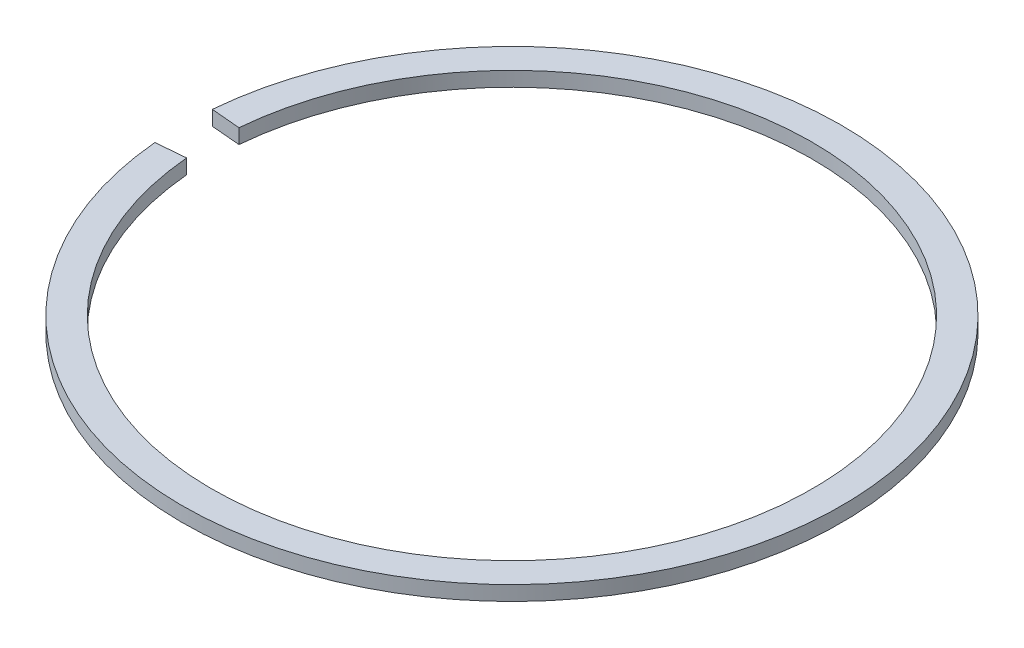
ISO-10303-21;
HEADER;
FILE_DESCRIPTION(('STEP AP214'),'2;1');
FILE_NAME('part.step','',(''),(''),'','','');
FILE_SCHEMA(('AUTOMOTIVE_DESIGN { 1 0 10303 214 1 1 1 1 }'));
ENDSEC;
DATA;
#1=APPLICATION_CONTEXT('core data for automotive mechanical design processes');
#2=APPLICATION_PROTOCOL_DEFINITION('international standard','automotive_design',2000,#1);
#3=PRODUCT_CONTEXT('',#1,'mechanical');
#4=PRODUCT('Part','Part','',(#3));
#5=PRODUCT_RELATED_PRODUCT_CATEGORY('part','',(#4));
#6=PRODUCT_DEFINITION_FORMATION('','',#4);
#7=PRODUCT_DEFINITION_CONTEXT('part definition',#1,'design');
#8=PRODUCT_DEFINITION('design','',#6,#7);
#9=PRODUCT_DEFINITION_SHAPE('','',#8);
#10=(LENGTH_UNIT() NAMED_UNIT(*) SI_UNIT(.MILLI.,.METRE.));
#11=(NAMED_UNIT(*) PLANE_ANGLE_UNIT() SI_UNIT($,.RADIAN.));
#12=(NAMED_UNIT(*) SI_UNIT($,.STERADIAN.) SOLID_ANGLE_UNIT());
#13=UNCERTAINTY_MEASURE_WITH_UNIT(LENGTH_MEASURE(1.E-05),#10,'distance_accuracy_value','');
#14=(GEOMETRIC_REPRESENTATION_CONTEXT(3) GLOBAL_UNCERTAINTY_ASSIGNED_CONTEXT((#13)) GLOBAL_UNIT_ASSIGNED_CONTEXT((#10,
#11,#12)) REPRESENTATION_CONTEXT('',''));
#15=CARTESIAN_POINT('',(0.,0.,0.));
#16=DIRECTION('',(0.,0.,1.));
#17=DIRECTION('',(1.,0.,0.));
#18=AXIS2_PLACEMENT_3D('',#15,#16,#17);
#19=CARTESIAN_POINT('',(0.,0.,0.));
#20=DIRECTION('',(0.,-1.,0.));
#21=DIRECTION('',(0.,0.,-1.));
#22=AXIS2_PLACEMENT_3D('',#19,#20,#21);
#23=CYLINDRICAL_SURFACE('',#22,41.);
#24=CARTESIAN_POINT('',(0.,0.,0.));
#25=DIRECTION('',(0.,-1.,0.));
#26=DIRECTION('',(0.,0.,-1.));
#27=AXIS2_PLACEMENT_3D('',#24,#25,#26);
#28=CIRCLE('',#27,41.);
#29=CARTESIAN_POINT('',(-40.8439826217616,0.,-3.57338545265371));
#30=VERTEX_POINT('',#29);
#31=CARTESIAN_POINT('',(-40.8439826217616,0.,3.57338545265371));
#32=VERTEX_POINT('',#31);
#33=EDGE_CURVE('E11',#30,#32,#28,.T.);
#34=ORIENTED_EDGE('',*,*,#33,.T.);
#35=DIRECTION('',(0.,-1.,0.));
#36=VECTOR('',#35,1.);
#37=CARTESIAN_POINT('',(-40.8439826217616,2.,3.57338545265371));
#38=LINE('',#37,#36);
#39=CARTESIAN_POINT('',(-40.8439826217616,2.,3.57338545265371));
#40=VERTEX_POINT('',#39);
#41=EDGE_CURVE('E76',#40,#32,#38,.T.);
#42=ORIENTED_EDGE('',*,*,#41,.F.);
#43=CARTESIAN_POINT('',(0.,2.,0.));
#44=DIRECTION('',(0.,-1.,0.));
#45=DIRECTION('',(0.,0.,-1.));
#46=AXIS2_PLACEMENT_3D('',#43,#44,#45);
#47=CIRCLE('',#46,41.);
#48=CARTESIAN_POINT('',(-40.8439826217616,2.,-3.57338545265371));
#49=VERTEX_POINT('',#48);
#50=EDGE_CURVE('E51',#49,#40,#47,.T.);
#51=ORIENTED_EDGE('',*,*,#50,.F.);
#52=DIRECTION('',(0.,-1.,0.));
#53=VECTOR('',#52,1.);
#54=CARTESIAN_POINT('',(-40.8439826217616,2.,-3.57338545265371));
#55=LINE('',#54,#53);
#56=EDGE_CURVE('E78',#49,#30,#55,.T.);
#57=ORIENTED_EDGE('',*,*,#56,.T.);
#58=EDGE_LOOP('',(#34,#42,#51,#57));
#59=FACE_BOUND('',#58,.T.);
#60=ADVANCED_FACE('F36',(#59),#23,.F.);
#61=CARTESIAN_POINT('',(-40.8439826217616,0.,-3.57338545265371));
#62=DIRECTION('',(0.,-1.,0.));
#63=DIRECTION('',(0.,0.,-1.));
#64=AXIS2_PLACEMENT_3D('',#61,#62,#63);
#65=PLANE('',#64);
#66=CARTESIAN_POINT('',(0.,0.,0.));
#67=DIRECTION('',(0.,-1.,0.));
#68=DIRECTION('',(0.,0.,-1.));
#69=AXIS2_PLACEMENT_3D('',#66,#67,#68);
#70=CIRCLE('',#69,45.);
#71=CARTESIAN_POINT('',(-44.8287614141286,0.,-3.92200842364432));
#72=VERTEX_POINT('',#71);
#73=CARTESIAN_POINT('',(-44.8287614141286,0.,3.92200842364432));
#74=VERTEX_POINT('',#73);
#75=EDGE_CURVE('E44',#72,#74,#70,.T.);
#76=ORIENTED_EDGE('',*,*,#75,.T.);
#77=DIRECTION('',(-0.996194698091746,0.,0.0871557427476516));
#78=VECTOR('',#77,1.);
#79=CARTESIAN_POINT('',(-40.8439826217616,0.,3.57338545265371));
#80=LINE('',#79,#78);
#81=EDGE_CURVE('E87',#32,#74,#80,.T.);
#82=ORIENTED_EDGE('',*,*,#81,.F.);
#83=ORIENTED_EDGE('',*,*,#33,.F.);
#84=DIRECTION('',(-0.996194698091746,0.,-0.0871557427476515));
#85=VECTOR('',#84,1.);
#86=CARTESIAN_POINT('',(-40.8439826217616,0.,-3.57338545265371));
#87=LINE('',#86,#85);
#88=EDGE_CURVE('E97',#30,#72,#87,.T.);
#89=ORIENTED_EDGE('',*,*,#88,.T.);
#90=EDGE_LOOP('',(#76,#82,#83,#89));
#91=FACE_BOUND('',#90,.T.);
#92=ADVANCED_FACE('F38',(#91),#65,.T.);
#93=CARTESIAN_POINT('',(0.,0.,0.));
#94=DIRECTION('',(0.,-1.,0.));
#95=DIRECTION('',(0.,0.,-1.));
#96=AXIS2_PLACEMENT_3D('',#93,#94,#95);
#97=CYLINDRICAL_SURFACE('',#96,45.);
#98=CARTESIAN_POINT('',(0.,2.,0.));
#99=DIRECTION('',(0.,-1.,0.));
#100=DIRECTION('',(0.,0.,-1.));
#101=AXIS2_PLACEMENT_3D('',#98,#99,#100);
#102=CIRCLE('',#101,45.);
#103=CARTESIAN_POINT('',(-44.8287614141286,2.,-3.92200842364432));
#104=VERTEX_POINT('',#103);
#105=CARTESIAN_POINT('',(-44.8287614141286,2.,3.92200842364432));
#106=VERTEX_POINT('',#105);
#107=EDGE_CURVE('E59',#104,#106,#102,.T.);
#108=ORIENTED_EDGE('',*,*,#107,.T.);
#109=DIRECTION('',(0.,1.,0.));
#110=VECTOR('',#109,1.);
#111=CARTESIAN_POINT('',(-44.8287614141286,2.,3.92200842364432));
#112=LINE('',#111,#110);
#113=EDGE_CURVE('E91',#74,#106,#112,.T.);
#114=ORIENTED_EDGE('',*,*,#113,.F.);
#115=ORIENTED_EDGE('',*,*,#75,.F.);
#116=DIRECTION('',(0.,1.,0.));
#117=VECTOR('',#116,1.);
#118=CARTESIAN_POINT('',(-44.8287614141286,2.,-3.92200842364432));
#119=LINE('',#118,#117);
#120=EDGE_CURVE('E99',#72,#104,#119,.T.);
#121=ORIENTED_EDGE('',*,*,#120,.T.);
#122=EDGE_LOOP('',(#108,#114,#115,#121));
#123=FACE_BOUND('',#122,.T.);
#124=ADVANCED_FACE('F105',(#123),#97,.T.);
#125=CARTESIAN_POINT('',(-40.8439826217616,2.,-3.57338545265371));
#126=DIRECTION('',(0.,1.,0.));
#127=DIRECTION('',(0.,0.,1.));
#128=AXIS2_PLACEMENT_3D('',#125,#126,#127);
#129=PLANE('',#128);
#130=DIRECTION('',(0.996194698091746,0.,0.0871557427476515));
#131=VECTOR('',#130,1.);
#132=CARTESIAN_POINT('',(-40.8439826217616,2.,-3.57338545265371));
#133=LINE('',#132,#131);
#134=EDGE_CURVE('E101',#104,#49,#133,.T.);
#135=ORIENTED_EDGE('',*,*,#134,.T.);
#136=ORIENTED_EDGE('',*,*,#50,.T.);
#137=DIRECTION('',(0.996194698091746,0.,-0.0871557427476516));
#138=VECTOR('',#137,1.);
#139=CARTESIAN_POINT('',(-40.8439826217616,2.,3.57338545265371));
#140=LINE('',#139,#138);
#141=EDGE_CURVE('E89',#106,#40,#140,.T.);
#142=ORIENTED_EDGE('',*,*,#141,.F.);
#143=ORIENTED_EDGE('',*,*,#107,.F.);
#144=EDGE_LOOP('',(#135,#136,#142,#143));
#145=FACE_BOUND('',#144,.T.);
#146=ADVANCED_FACE('F108',(#145),#129,.T.);
#147=CARTESIAN_POINT('',(0.,0.,0.));
#148=DIRECTION('',(0.0871557427476515,0.,-0.996194698091746));
#149=DIRECTION('',(-0.996194698091746,0.,-0.0871557427476515));
#150=AXIS2_PLACEMENT_3D('',#147,#148,#149);
#151=PLANE('',#150);
#152=ORIENTED_EDGE('',*,*,#56,.F.);
#153=ORIENTED_EDGE('',*,*,#134,.F.);
#154=ORIENTED_EDGE('',*,*,#120,.F.);
#155=ORIENTED_EDGE('',*,*,#88,.F.);
#156=EDGE_LOOP('',(#152,#153,#154,#155));
#157=FACE_BOUND('',#156,.T.);
#158=ADVANCED_FACE('F110',(#157),#151,.F.);
#159=CARTESIAN_POINT('',(0.,0.,0.));
#160=DIRECTION('',(-0.0871557427476516,0.,-0.996194698091746));
#161=DIRECTION('',(-0.996194698091746,0.,0.0871557427476516));
#162=AXIS2_PLACEMENT_3D('',#159,#160,#161);
#163=PLANE('',#162);
#164=ORIENTED_EDGE('',*,*,#41,.T.);
#165=ORIENTED_EDGE('',*,*,#81,.T.);
#166=ORIENTED_EDGE('',*,*,#113,.T.);
#167=ORIENTED_EDGE('',*,*,#141,.T.);
#168=EDGE_LOOP('',(#164,#165,#166,#167));
#169=FACE_BOUND('',#168,.T.);
#170=ADVANCED_FACE('F85',(#169),#163,.T.);
#171=CLOSED_SHELL('',(#60,#92,#124,#146,#158,#170));
#172=MANIFOLD_SOLID_BREP('B2',#171);
#173=ADVANCED_BREP_SHAPE_REPRESENTATION('',(#18,#172),#14);
#174=SHAPE_DEFINITION_REPRESENTATION(#9,#173);
ENDSEC;
END-ISO-10303-21;
